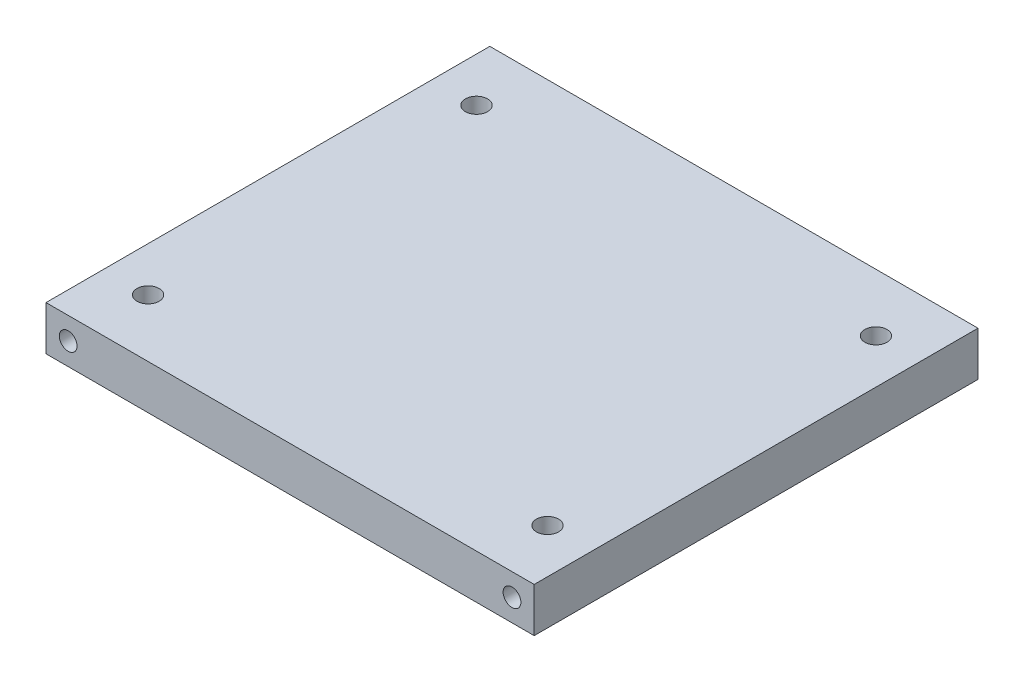
ISO-10303-21;
HEADER;
FILE_DESCRIPTION(('STEP AP214'),'2;1');
FILE_NAME('part.step','',(''),(''),'','','');
FILE_SCHEMA(('AUTOMOTIVE_DESIGN { 1 0 10303 214 1 1 1 1 }'));
ENDSEC;
DATA;
#1=APPLICATION_CONTEXT('core data for automotive mechanical design processes');
#2=APPLICATION_PROTOCOL_DEFINITION('international standard','automotive_design',2000,#1);
#3=PRODUCT_CONTEXT('',#1,'mechanical');
#4=PRODUCT('Part','Part','',(#3));
#5=PRODUCT_RELATED_PRODUCT_CATEGORY('part','',(#4));
#6=PRODUCT_DEFINITION_FORMATION('','',#4);
#7=PRODUCT_DEFINITION_CONTEXT('part definition',#1,'design');
#8=PRODUCT_DEFINITION('design','',#6,#7);
#9=PRODUCT_DEFINITION_SHAPE('','',#8);
#10=(LENGTH_UNIT() NAMED_UNIT(*) SI_UNIT(.MILLI.,.METRE.));
#11=(NAMED_UNIT(*) PLANE_ANGLE_UNIT() SI_UNIT($,.RADIAN.));
#12=(NAMED_UNIT(*) SI_UNIT($,.STERADIAN.) SOLID_ANGLE_UNIT());
#13=UNCERTAINTY_MEASURE_WITH_UNIT(LENGTH_MEASURE(1.E-05),#10,'distance_accuracy_value','');
#14=(GEOMETRIC_REPRESENTATION_CONTEXT(3) GLOBAL_UNCERTAINTY_ASSIGNED_CONTEXT((#13)) GLOBAL_UNIT_ASSIGNED_CONTEXT((#10,
#11,#12)) REPRESENTATION_CONTEXT('',''));
#15=CARTESIAN_POINT('',(0.,0.,0.));
#16=DIRECTION('',(0.,0.,1.));
#17=DIRECTION('',(1.,0.,0.));
#18=AXIS2_PLACEMENT_3D('',#15,#16,#17);
#19=CARTESIAN_POINT('',(55.,10.,-50.));
#20=DIRECTION('',(-1.,0.,0.));
#21=DIRECTION('',(0.,0.,1.));
#22=AXIS2_PLACEMENT_3D('',#19,#20,#21);
#23=PLANE('',#22);
#24=DIRECTION('',(0.,0.,-1.));
#25=VECTOR('',#24,1.);
#26=CARTESIAN_POINT('',(55.,0.,-50.));
#27=LINE('',#26,#25);
#28=CARTESIAN_POINT('',(55.,0.,50.));
#29=VERTEX_POINT('',#28);
#30=CARTESIAN_POINT('',(55.,0.,-50.));
#31=VERTEX_POINT('',#30);
#32=EDGE_CURVE('E102',#29,#31,#27,.T.);
#33=ORIENTED_EDGE('',*,*,#32,.T.);
#34=DIRECTION('',(0.,-1.,0.));
#35=VECTOR('',#34,1.);
#36=CARTESIAN_POINT('',(55.,10.,-50.));
#37=LINE('',#36,#35);
#38=CARTESIAN_POINT('',(55.,10.,-50.));
#39=VERTEX_POINT('',#38);
#40=EDGE_CURVE('E11',#39,#31,#37,.T.);
#41=ORIENTED_EDGE('',*,*,#40,.F.);
#42=DIRECTION('',(0.,0.,-1.));
#43=VECTOR('',#42,1.);
#44=CARTESIAN_POINT('',(55.,10.,-50.));
#45=LINE('',#44,#43);
#46=CARTESIAN_POINT('',(55.,10.,50.));
#47=VERTEX_POINT('',#46);
#48=EDGE_CURVE('E90',#47,#39,#45,.T.);
#49=ORIENTED_EDGE('',*,*,#48,.F.);
#50=DIRECTION('',(0.,-1.,0.));
#51=VECTOR('',#50,1.);
#52=CARTESIAN_POINT('',(55.,10.,50.));
#53=LINE('',#52,#51);
#54=EDGE_CURVE('E98',#47,#29,#53,.T.);
#55=ORIENTED_EDGE('',*,*,#54,.T.);
#56=EDGE_LOOP('',(#33,#41,#49,#55));
#57=FACE_BOUND('',#56,.T.);
#58=ADVANCED_FACE('F39',(#57),#23,.F.);
#59=CARTESIAN_POINT('',(-55.,10.,-50.));
#60=DIRECTION('',(0.,0.,1.));
#61=DIRECTION('',(1.,0.,0.));
#62=AXIS2_PLACEMENT_3D('',#59,#60,#61);
#63=PLANE('',#62);
#64=CARTESIAN_POINT('',(-50.,4.99999999999989,-50.));
#65=DIRECTION('',(0.,0.,1.));
#66=DIRECTION('',(1.,0.,0.));
#67=AXIS2_PLACEMENT_3D('',#64,#65,#66);
#68=CIRCLE('',#67,2.);
#69=CARTESIAN_POINT('',(-48.,4.99999999999989,-50.));
#70=VERTEX_POINT('',#69);
#71=EDGE_CURVE('E105',#70,#70,#68,.T.);
#72=ORIENTED_EDGE('',*,*,#71,.T.);
#73=EDGE_LOOP('',(#72));
#74=FACE_BOUND('',#73,.T.);
#75=CARTESIAN_POINT('',(50.,4.99999999999989,-50.));
#76=DIRECTION('',(0.,0.,1.));
#77=DIRECTION('',(-1.,0.,0.));
#78=AXIS2_PLACEMENT_3D('',#75,#76,#77);
#79=CIRCLE('',#78,2.);
#80=CARTESIAN_POINT('',(48.,4.99999999999989,-50.));
#81=VERTEX_POINT('',#80);
#82=EDGE_CURVE('E119',#81,#81,#79,.T.);
#83=ORIENTED_EDGE('',*,*,#82,.T.);
#84=EDGE_LOOP('',(#83));
#85=FACE_BOUND('',#84,.T.);
#86=DIRECTION('',(-1.,0.,0.));
#87=VECTOR('',#86,1.);
#88=CARTESIAN_POINT('',(-55.,0.,-50.));
#89=LINE('',#88,#87);
#90=CARTESIAN_POINT('',(-55.,0.,-50.));
#91=VERTEX_POINT('',#90);
#92=EDGE_CURVE('E94',#31,#91,#89,.T.);
#93=ORIENTED_EDGE('',*,*,#92,.T.);
#94=DIRECTION('',(0.,-1.,0.));
#95=VECTOR('',#94,1.);
#96=CARTESIAN_POINT('',(-55.,10.,-50.));
#97=LINE('',#96,#95);
#98=CARTESIAN_POINT('',(-55.,10.,-50.));
#99=VERTEX_POINT('',#98);
#100=EDGE_CURVE('E47',#99,#91,#97,.T.);
#101=ORIENTED_EDGE('',*,*,#100,.F.);
#102=DIRECTION('',(-1.,0.,0.));
#103=VECTOR('',#102,1.);
#104=CARTESIAN_POINT('',(-55.,10.,-50.));
#105=LINE('',#104,#103);
#106=EDGE_CURVE('E85',#39,#99,#105,.T.);
#107=ORIENTED_EDGE('',*,*,#106,.F.);
#108=ORIENTED_EDGE('',*,*,#40,.T.);
#109=EDGE_LOOP('',(#93,#101,#107,#108));
#110=FACE_BOUND('',#109,.T.);
#111=ADVANCED_FACE('F93',(#74,#85,#110),#63,.F.);
#112=CARTESIAN_POINT('',(-55.,10.,-50.));
#113=DIRECTION('',(1.,0.,0.));
#114=DIRECTION('',(0.,0.,-1.));
#115=AXIS2_PLACEMENT_3D('',#112,#113,#114);
#116=PLANE('',#115);
#117=DIRECTION('',(0.,0.,1.));
#118=VECTOR('',#117,1.);
#119=CARTESIAN_POINT('',(-55.,0.,-50.));
#120=LINE('',#119,#118);
#121=CARTESIAN_POINT('',(-55.,0.,50.));
#122=VERTEX_POINT('',#121);
#123=EDGE_CURVE('E72',#91,#122,#120,.T.);
#124=ORIENTED_EDGE('',*,*,#123,.T.);
#125=DIRECTION('',(0.,-1.,0.));
#126=VECTOR('',#125,1.);
#127=CARTESIAN_POINT('',(-55.,10.,50.));
#128=LINE('',#127,#126);
#129=CARTESIAN_POINT('',(-55.,10.,50.));
#130=VERTEX_POINT('',#129);
#131=EDGE_CURVE('E95',#130,#122,#128,.T.);
#132=ORIENTED_EDGE('',*,*,#131,.F.);
#133=DIRECTION('',(0.,0.,1.));
#134=VECTOR('',#133,1.);
#135=CARTESIAN_POINT('',(-55.,10.,-50.));
#136=LINE('',#135,#134);
#137=EDGE_CURVE('E88',#99,#130,#136,.T.);
#138=ORIENTED_EDGE('',*,*,#137,.F.);
#139=ORIENTED_EDGE('',*,*,#100,.T.);
#140=EDGE_LOOP('',(#124,#132,#138,#139));
#141=FACE_BOUND('',#140,.T.);
#142=ADVANCED_FACE('F96',(#141),#116,.F.);
#143=CARTESIAN_POINT('',(-55.,10.,50.));
#144=DIRECTION('',(0.,0.,-1.));
#145=DIRECTION('',(-1.,0.,0.));
#146=AXIS2_PLACEMENT_3D('',#143,#144,#145);
#147=PLANE('',#146);
#148=CARTESIAN_POINT('',(-50.,4.99999999999989,50.));
#149=DIRECTION('',(0.,0.,1.));
#150=DIRECTION('',(1.,0.,0.));
#151=AXIS2_PLACEMENT_3D('',#148,#149,#150);
#152=CIRCLE('',#151,2.);
#153=CARTESIAN_POINT('',(-48.,4.99999999999989,50.));
#154=VERTEX_POINT('',#153);
#155=EDGE_CURVE('E123',#154,#154,#152,.T.);
#156=ORIENTED_EDGE('',*,*,#155,.F.);
#157=EDGE_LOOP('',(#156));
#158=FACE_BOUND('',#157,.T.);
#159=CARTESIAN_POINT('',(50.,4.99999999999989,50.));
#160=DIRECTION('',(0.,0.,1.));
#161=DIRECTION('',(-1.,0.,0.));
#162=AXIS2_PLACEMENT_3D('',#159,#160,#161);
#163=CIRCLE('',#162,2.);
#164=CARTESIAN_POINT('',(48.,4.99999999999989,50.));
#165=VERTEX_POINT('',#164);
#166=EDGE_CURVE('E116',#165,#165,#163,.T.);
#167=ORIENTED_EDGE('',*,*,#166,.F.);
#168=EDGE_LOOP('',(#167));
#169=FACE_BOUND('',#168,.T.);
#170=DIRECTION('',(1.,0.,0.));
#171=VECTOR('',#170,1.);
#172=CARTESIAN_POINT('',(-55.,0.,50.));
#173=LINE('',#172,#171);
#174=EDGE_CURVE('E78',#122,#29,#173,.T.);
#175=ORIENTED_EDGE('',*,*,#174,.T.);
#176=ORIENTED_EDGE('',*,*,#54,.F.);
#177=DIRECTION('',(1.,0.,0.));
#178=VECTOR('',#177,1.);
#179=CARTESIAN_POINT('',(-55.,10.,50.));
#180=LINE('',#179,#178);
#181=EDGE_CURVE('E55',#130,#47,#180,.T.);
#182=ORIENTED_EDGE('',*,*,#181,.F.);
#183=ORIENTED_EDGE('',*,*,#131,.T.);
#184=EDGE_LOOP('',(#175,#176,#182,#183));
#185=FACE_BOUND('',#184,.T.);
#186=ADVANCED_FACE('F110',(#158,#169,#185),#147,.F.);
#187=CARTESIAN_POINT('',(0.,10.,0.));
#188=DIRECTION('',(0.,1.,0.));
#189=DIRECTION('',(0.,0.,1.));
#190=AXIS2_PLACEMENT_3D('',#187,#188,#189);
#191=PLANE('',#190);
#192=CARTESIAN_POINT('',(-45.,10.,-37.));
#193=DIRECTION('',(0.,1.,0.));
#194=DIRECTION('',(0.,0.,-1.));
#195=AXIS2_PLACEMENT_3D('',#192,#193,#194);
#196=CIRCLE('',#195,2.5);
#197=CARTESIAN_POINT('',(-45.,10.,-39.5));
#198=VERTEX_POINT('',#197);
#199=EDGE_CURVE('E134',#198,#198,#196,.T.);
#200=ORIENTED_EDGE('',*,*,#199,.F.);
#201=EDGE_LOOP('',(#200));
#202=FACE_BOUND('',#201,.T.);
#203=CARTESIAN_POINT('',(45.0000000000002,10.,-36.9999999999998));
#204=DIRECTION('',(0.,1.,0.));
#205=DIRECTION('',(0.,0.,1.));
#206=AXIS2_PLACEMENT_3D('',#203,#204,#205);
#207=CIRCLE('',#206,2.5);
#208=CARTESIAN_POINT('',(45.0000000000002,10.,-34.4999999999998));
#209=VERTEX_POINT('',#208);
#210=EDGE_CURVE('E140',#209,#209,#207,.T.);
#211=ORIENTED_EDGE('',*,*,#210,.F.);
#212=EDGE_LOOP('',(#211));
#213=FACE_BOUND('',#212,.T.);
#214=CARTESIAN_POINT('',(45.0000000000002,10.,36.9999999999998));
#215=DIRECTION('',(0.,1.,0.));
#216=DIRECTION('',(0.,0.,-1.));
#217=AXIS2_PLACEMENT_3D('',#214,#215,#216);
#218=CIRCLE('',#217,2.5);
#219=CARTESIAN_POINT('',(45.0000000000002,10.,34.4999999999998));
#220=VERTEX_POINT('',#219);
#221=EDGE_CURVE('E146',#220,#220,#218,.T.);
#222=ORIENTED_EDGE('',*,*,#221,.F.);
#223=EDGE_LOOP('',(#222));
#224=FACE_BOUND('',#223,.T.);
#225=CARTESIAN_POINT('',(-45.,10.,37.));
#226=DIRECTION('',(0.,1.,0.));
#227=DIRECTION('',(0.,0.,1.));
#228=AXIS2_PLACEMENT_3D('',#225,#226,#227);
#229=CIRCLE('',#228,2.5);
#230=CARTESIAN_POINT('',(-45.,10.,39.5));
#231=VERTEX_POINT('',#230);
#232=EDGE_CURVE('E128',#231,#231,#229,.T.);
#233=ORIENTED_EDGE('',*,*,#232,.F.);
#234=EDGE_LOOP('',(#233));
#235=FACE_BOUND('',#234,.T.);
#236=ORIENTED_EDGE('',*,*,#48,.T.);
#237=ORIENTED_EDGE('',*,*,#106,.T.);
#238=ORIENTED_EDGE('',*,*,#137,.T.);
#239=ORIENTED_EDGE('',*,*,#181,.T.);
#240=EDGE_LOOP('',(#236,#237,#238,#239));
#241=FACE_BOUND('',#240,.T.);
#242=ADVANCED_FACE('F86',(#202,#213,#224,#235,#241),#191,.T.);
#243=CARTESIAN_POINT('',(0.,0.,0.));
#244=DIRECTION('',(0.,1.,0.));
#245=DIRECTION('',(0.,0.,1.));
#246=AXIS2_PLACEMENT_3D('',#243,#244,#245);
#247=PLANE('',#246);
#248=CARTESIAN_POINT('',(-45.,0.,-37.));
#249=DIRECTION('',(0.,1.,0.));
#250=DIRECTION('',(0.,0.,-1.));
#251=AXIS2_PLACEMENT_3D('',#248,#249,#250);
#252=CIRCLE('',#251,2.5);
#253=CARTESIAN_POINT('',(-45.,0.,-39.5));
#254=VERTEX_POINT('',#253);
#255=EDGE_CURVE('E137',#254,#254,#252,.T.);
#256=ORIENTED_EDGE('',*,*,#255,.T.);
#257=EDGE_LOOP('',(#256));
#258=FACE_BOUND('',#257,.T.);
#259=CARTESIAN_POINT('',(45.0000000000002,0.,-36.9999999999998));
#260=DIRECTION('',(0.,1.,0.));
#261=DIRECTION('',(0.,0.,1.));
#262=AXIS2_PLACEMENT_3D('',#259,#260,#261);
#263=CIRCLE('',#262,2.5);
#264=CARTESIAN_POINT('',(45.0000000000002,0.,-34.4999999999998));
#265=VERTEX_POINT('',#264);
#266=EDGE_CURVE('E143',#265,#265,#263,.T.);
#267=ORIENTED_EDGE('',*,*,#266,.T.);
#268=EDGE_LOOP('',(#267));
#269=FACE_BOUND('',#268,.T.);
#270=CARTESIAN_POINT('',(45.0000000000002,0.,36.9999999999998));
#271=DIRECTION('',(0.,1.,0.));
#272=DIRECTION('',(0.,0.,-1.));
#273=AXIS2_PLACEMENT_3D('',#270,#271,#272);
#274=CIRCLE('',#273,2.5);
#275=CARTESIAN_POINT('',(45.0000000000002,0.,34.4999999999998));
#276=VERTEX_POINT('',#275);
#277=EDGE_CURVE('E131',#276,#276,#274,.T.);
#278=ORIENTED_EDGE('',*,*,#277,.T.);
#279=EDGE_LOOP('',(#278));
#280=FACE_BOUND('',#279,.T.);
#281=CARTESIAN_POINT('',(-45.,0.,37.));
#282=DIRECTION('',(0.,1.,0.));
#283=DIRECTION('',(0.,0.,1.));
#284=AXIS2_PLACEMENT_3D('',#281,#282,#283);
#285=CIRCLE('',#284,2.5);
#286=CARTESIAN_POINT('',(-45.,0.,39.5));
#287=VERTEX_POINT('',#286);
#288=EDGE_CURVE('E120',#287,#287,#285,.T.);
#289=ORIENTED_EDGE('',*,*,#288,.T.);
#290=EDGE_LOOP('',(#289));
#291=FACE_BOUND('',#290,.T.);
#292=ORIENTED_EDGE('',*,*,#32,.F.);
#293=ORIENTED_EDGE('',*,*,#174,.F.);
#294=ORIENTED_EDGE('',*,*,#123,.F.);
#295=ORIENTED_EDGE('',*,*,#92,.F.);
#296=EDGE_LOOP('',(#292,#293,#294,#295));
#297=FACE_BOUND('',#296,.T.);
#298=ADVANCED_FACE('F113',(#258,#269,#280,#291,#297),#247,.F.);
#299=CARTESIAN_POINT('',(50.,4.99999999999989,-50.));
#300=DIRECTION('',(0.,0.,1.));
#301=DIRECTION('',(1.,0.,0.));
#302=AXIS2_PLACEMENT_3D('',#299,#300,#301);
#303=CYLINDRICAL_SURFACE('',#302,2.);
#304=ORIENTED_EDGE('',*,*,#82,.F.);
#305=EDGE_LOOP('',(#304));
#306=FACE_BOUND('',#305,.T.);
#307=ORIENTED_EDGE('',*,*,#166,.T.);
#308=EDGE_LOOP('',(#307));
#309=FACE_BOUND('',#308,.T.);
#310=ADVANCED_FACE('F175',(#306,#309),#303,.F.);
#311=CARTESIAN_POINT('',(-50.,4.99999999999989,-50.));
#312=DIRECTION('',(0.,0.,1.));
#313=DIRECTION('',(1.,0.,0.));
#314=AXIS2_PLACEMENT_3D('',#311,#312,#313);
#315=CYLINDRICAL_SURFACE('',#314,2.);
#316=ORIENTED_EDGE('',*,*,#71,.F.);
#317=EDGE_LOOP('',(#316));
#318=FACE_BOUND('',#317,.T.);
#319=ORIENTED_EDGE('',*,*,#155,.T.);
#320=EDGE_LOOP('',(#319));
#321=FACE_BOUND('',#320,.T.);
#322=ADVANCED_FACE('F169',(#318,#321),#315,.F.);
#323=CARTESIAN_POINT('',(-45.,0.,37.));
#324=DIRECTION('',(0.,1.,0.));
#325=DIRECTION('',(0.,0.,1.));
#326=AXIS2_PLACEMENT_3D('',#323,#324,#325);
#327=CYLINDRICAL_SURFACE('',#326,2.5);
#328=ORIENTED_EDGE('',*,*,#288,.F.);
#329=EDGE_LOOP('',(#328));
#330=FACE_BOUND('',#329,.T.);
#331=ORIENTED_EDGE('',*,*,#232,.T.);
#332=EDGE_LOOP('',(#331));
#333=FACE_BOUND('',#332,.T.);
#334=ADVANCED_FACE('F158',(#330,#333),#327,.F.);
#335=CARTESIAN_POINT('',(45.0000000000002,0.,36.9999999999998));
#336=DIRECTION('',(0.,1.,0.));
#337=DIRECTION('',(0.,0.,1.));
#338=AXIS2_PLACEMENT_3D('',#335,#336,#337);
#339=CYLINDRICAL_SURFACE('',#338,2.5);
#340=ORIENTED_EDGE('',*,*,#277,.F.);
#341=EDGE_LOOP('',(#340));
#342=FACE_BOUND('',#341,.T.);
#343=ORIENTED_EDGE('',*,*,#221,.T.);
#344=EDGE_LOOP('',(#343));
#345=FACE_BOUND('',#344,.T.);
#346=ADVANCED_FACE('F154',(#342,#345),#339,.F.);
#347=CARTESIAN_POINT('',(45.0000000000002,0.,-36.9999999999998));
#348=DIRECTION('',(0.,1.,0.));
#349=DIRECTION('',(0.,0.,1.));
#350=AXIS2_PLACEMENT_3D('',#347,#348,#349);
#351=CYLINDRICAL_SURFACE('',#350,2.5);
#352=ORIENTED_EDGE('',*,*,#266,.F.);
#353=EDGE_LOOP('',(#352));
#354=FACE_BOUND('',#353,.T.);
#355=ORIENTED_EDGE('',*,*,#210,.T.);
#356=EDGE_LOOP('',(#355));
#357=FACE_BOUND('',#356,.T.);
#358=ADVANCED_FACE('F157',(#354,#357),#351,.F.);
#359=CARTESIAN_POINT('',(-45.,0.,-37.));
#360=DIRECTION('',(0.,1.,0.));
#361=DIRECTION('',(0.,0.,1.));
#362=AXIS2_PLACEMENT_3D('',#359,#360,#361);
#363=CYLINDRICAL_SURFACE('',#362,2.5);
#364=ORIENTED_EDGE('',*,*,#255,.F.);
#365=EDGE_LOOP('',(#364));
#366=FACE_BOUND('',#365,.T.);
#367=ORIENTED_EDGE('',*,*,#199,.T.);
#368=EDGE_LOOP('',(#367));
#369=FACE_BOUND('',#368,.T.);
#370=ADVANCED_FACE('F237',(#366,#369),#363,.F.);
#371=CLOSED_SHELL('',(#58,#111,#142,#186,#242,#298,#310,#322,#334,#346,#358,#370));
#372=MANIFOLD_SOLID_BREP('B2',#371);
#373=ADVANCED_BREP_SHAPE_REPRESENTATION('',(#18,#372),#14);
#374=SHAPE_DEFINITION_REPRESENTATION(#9,#373);
ENDSEC;
END-ISO-10303-21;
